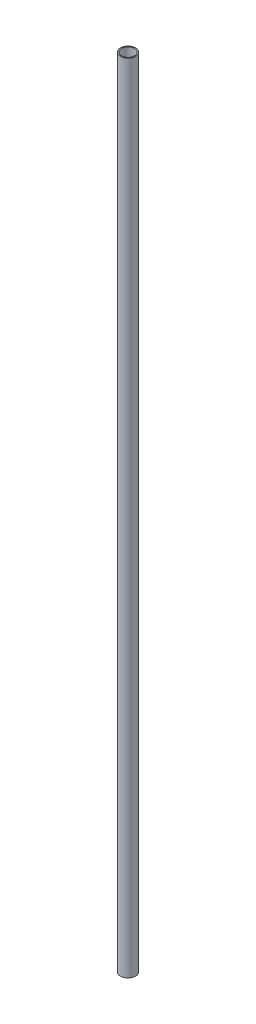
ISO-10303-21;
HEADER;
FILE_DESCRIPTION(('STEP AP214'),'2;1');
FILE_NAME('part.step','',(''),(''),'','','');
FILE_SCHEMA(('AUTOMOTIVE_DESIGN { 1 0 10303 214 1 1 1 1 }'));
ENDSEC;
DATA;
#1=APPLICATION_CONTEXT('core data for automotive mechanical design processes');
#2=APPLICATION_PROTOCOL_DEFINITION('international standard','automotive_design',2000,#1);
#3=PRODUCT_CONTEXT('',#1,'mechanical');
#4=PRODUCT('Part','Part','',(#3));
#5=PRODUCT_RELATED_PRODUCT_CATEGORY('part','',(#4));
#6=PRODUCT_DEFINITION_FORMATION('','',#4);
#7=PRODUCT_DEFINITION_CONTEXT('part definition',#1,'design');
#8=PRODUCT_DEFINITION('design','',#6,#7);
#9=PRODUCT_DEFINITION_SHAPE('','',#8);
#10=(LENGTH_UNIT() NAMED_UNIT(*) SI_UNIT(.MILLI.,.METRE.));
#11=(NAMED_UNIT(*) PLANE_ANGLE_UNIT() SI_UNIT($,.RADIAN.));
#12=(NAMED_UNIT(*) SI_UNIT($,.STERADIAN.) SOLID_ANGLE_UNIT());
#13=UNCERTAINTY_MEASURE_WITH_UNIT(LENGTH_MEASURE(1.E-05),#10,'distance_accuracy_value','');
#14=(GEOMETRIC_REPRESENTATION_CONTEXT(3) GLOBAL_UNCERTAINTY_ASSIGNED_CONTEXT((#13)) GLOBAL_UNIT_ASSIGNED_CONTEXT((#10,
#11,#12)) REPRESENTATION_CONTEXT('',''));
#15=CARTESIAN_POINT('',(0.,0.,0.));
#16=DIRECTION('',(0.,0.,1.));
#17=DIRECTION('',(1.,0.,0.));
#18=AXIS2_PLACEMENT_3D('',#15,#16,#17);
#19=CARTESIAN_POINT('',(0.,1600.,0.));
#20=DIRECTION('',(0.,1.,0.));
#21=DIRECTION('',(0.,0.,1.));
#22=AXIS2_PLACEMENT_3D('',#19,#20,#21);
#23=PLANE('',#22);
#24=CARTESIAN_POINT('',(0.,1600.,0.));
#25=DIRECTION('',(0.,1.,0.));
#26=DIRECTION('',(0.,0.,1.));
#27=AXIS2_PLACEMENT_3D('',#24,#25,#26);
#28=CIRCLE('',#27,15.);
#29=CARTESIAN_POINT('',(0.,1600.,15.));
#30=VERTEX_POINT('',#29);
#31=EDGE_CURVE('E10',#30,#30,#28,.T.);
#32=ORIENTED_EDGE('',*,*,#31,.T.);
#33=EDGE_LOOP('',(#32));
#34=FACE_BOUND('',#33,.T.);
#35=CARTESIAN_POINT('',(0.,1600.,0.));
#36=DIRECTION('',(0.,1.,0.));
#37=DIRECTION('',(0.,0.,1.));
#38=AXIS2_PLACEMENT_3D('',#35,#36,#37);
#39=CIRCLE('',#38,13.);
#40=CARTESIAN_POINT('',(0.,1600.,13.));
#41=VERTEX_POINT('',#40);
#42=EDGE_CURVE('E42',#41,#41,#39,.T.);
#43=ORIENTED_EDGE('',*,*,#42,.F.);
#44=EDGE_LOOP('',(#43));
#45=FACE_BOUND('',#44,.T.);
#46=ADVANCED_FACE('F31',(#34,#45),#23,.T.);
#47=CARTESIAN_POINT('',(0.,0.,0.));
#48=DIRECTION('',(0.,1.,0.));
#49=DIRECTION('',(0.,0.,1.));
#50=AXIS2_PLACEMENT_3D('',#47,#48,#49);
#51=PLANE('',#50);
#52=CARTESIAN_POINT('',(0.,0.,0.));
#53=DIRECTION('',(0.,1.,0.));
#54=DIRECTION('',(0.,0.,1.));
#55=AXIS2_PLACEMENT_3D('',#52,#53,#54);
#56=CIRCLE('',#55,15.);
#57=CARTESIAN_POINT('',(0.,0.,15.));
#58=VERTEX_POINT('',#57);
#59=EDGE_CURVE('E35',#58,#58,#56,.T.);
#60=ORIENTED_EDGE('',*,*,#59,.F.);
#61=EDGE_LOOP('',(#60));
#62=FACE_BOUND('',#61,.T.);
#63=CARTESIAN_POINT('',(0.,0.,0.));
#64=DIRECTION('',(0.,1.,0.));
#65=DIRECTION('',(0.,0.,1.));
#66=AXIS2_PLACEMENT_3D('',#63,#64,#65);
#67=CIRCLE('',#66,13.);
#68=CARTESIAN_POINT('',(0.,0.,13.));
#69=VERTEX_POINT('',#68);
#70=EDGE_CURVE('E44',#69,#69,#67,.T.);
#71=ORIENTED_EDGE('',*,*,#70,.T.);
#72=EDGE_LOOP('',(#71));
#73=FACE_BOUND('',#72,.T.);
#74=ADVANCED_FACE('F54',(#62,#73),#51,.F.);
#75=CARTESIAN_POINT('',(0.,1600.,0.));
#76=DIRECTION('',(0.,-1.,0.));
#77=DIRECTION('',(0.,0.,-1.));
#78=AXIS2_PLACEMENT_3D('',#75,#76,#77);
#79=CYLINDRICAL_SURFACE('',#78,15.);
#80=ORIENTED_EDGE('',*,*,#31,.F.);
#81=EDGE_LOOP('',(#80));
#82=FACE_BOUND('',#81,.T.);
#83=ORIENTED_EDGE('',*,*,#59,.T.);
#84=EDGE_LOOP('',(#83));
#85=FACE_BOUND('',#84,.T.);
#86=ADVANCED_FACE('F33',(#82,#85),#79,.T.);
#87=CARTESIAN_POINT('',(0.,1600.,0.));
#88=DIRECTION('',(0.,-1.,0.));
#89=DIRECTION('',(0.,0.,-1.));
#90=AXIS2_PLACEMENT_3D('',#87,#88,#89);
#91=CYLINDRICAL_SURFACE('',#90,13.);
#92=ORIENTED_EDGE('',*,*,#42,.T.);
#93=EDGE_LOOP('',(#92));
#94=FACE_BOUND('',#93,.T.);
#95=ORIENTED_EDGE('',*,*,#70,.F.);
#96=EDGE_LOOP('',(#95));
#97=FACE_BOUND('',#96,.T.);
#98=ADVANCED_FACE('F50',(#94,#97),#91,.F.);
#99=CLOSED_SHELL('',(#46,#74,#86,#98));
#100=MANIFOLD_SOLID_BREP('B2',#99);
#101=ADVANCED_BREP_SHAPE_REPRESENTATION('',(#18,#100),#14);
#102=SHAPE_DEFINITION_REPRESENTATION(#9,#101);
ENDSEC;
END-ISO-10303-21;
